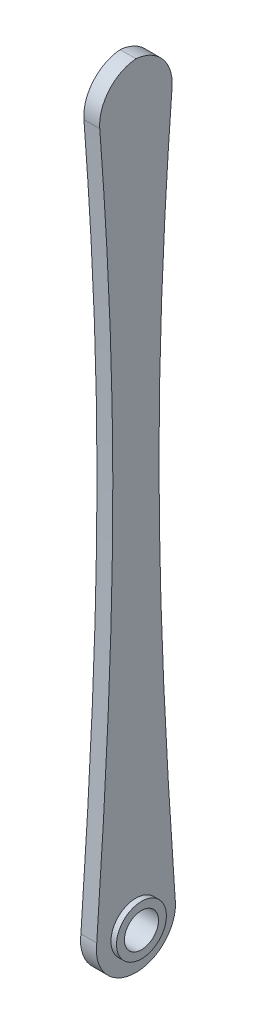
ISO-10303-21;
HEADER;
FILE_DESCRIPTION(('STEP AP214'),'2;1');
FILE_NAME('part.step','',(''),(''),'','','');
FILE_SCHEMA(('AUTOMOTIVE_DESIGN { 1 0 10303 214 1 1 1 1 }'));
ENDSEC;
DATA;
#1=APPLICATION_CONTEXT('core data for automotive mechanical design processes');
#2=APPLICATION_PROTOCOL_DEFINITION('international standard','automotive_design',2000,#1);
#3=PRODUCT_CONTEXT('',#1,'mechanical');
#4=PRODUCT('Part','Part','',(#3));
#5=PRODUCT_RELATED_PRODUCT_CATEGORY('part','',(#4));
#6=PRODUCT_DEFINITION_FORMATION('','',#4);
#7=PRODUCT_DEFINITION_CONTEXT('part definition',#1,'design');
#8=PRODUCT_DEFINITION('design','',#6,#7);
#9=PRODUCT_DEFINITION_SHAPE('','',#8);
#10=(LENGTH_UNIT() NAMED_UNIT(*) SI_UNIT(.MILLI.,.METRE.));
#11=(NAMED_UNIT(*) PLANE_ANGLE_UNIT() SI_UNIT($,.RADIAN.));
#12=(NAMED_UNIT(*) SI_UNIT($,.STERADIAN.) SOLID_ANGLE_UNIT());
#13=UNCERTAINTY_MEASURE_WITH_UNIT(LENGTH_MEASURE(1.E-05),#10,'distance_accuracy_value','');
#14=(GEOMETRIC_REPRESENTATION_CONTEXT(3) GLOBAL_UNCERTAINTY_ASSIGNED_CONTEXT((#13)) GLOBAL_UNIT_ASSIGNED_CONTEXT((#10,
#11,#12)) REPRESENTATION_CONTEXT('',''));
#15=CARTESIAN_POINT('',(0.,0.,0.));
#16=DIRECTION('',(0.,0.,1.));
#17=DIRECTION('',(1.,0.,0.));
#18=AXIS2_PLACEMENT_3D('',#15,#16,#17);
#19=CARTESIAN_POINT('',(2.,100.,0.));
#20=DIRECTION('',(-1.,0.,0.));
#21=DIRECTION('',(0.,0.,1.));
#22=AXIS2_PLACEMENT_3D('',#19,#20,#21);
#23=PLANE('',#22);
#24=CARTESIAN_POINT('',(2.00000000000003,5.,-10.));
#25=CARTESIAN_POINT('',(2.00000000000003,42.4076656753099,-7.33661914245611));
#26=CARTESIAN_POINT('',(2.00000000000003,65.4643007817263,-7.11394721951599));
#27=CARTESIAN_POINT('',(2.00000000000003,100.,-10.));
#28=B_SPLINE_CURVE_WITH_KNOTS('',3,(#24,#25,#26,#27),.UNSPECIFIED.,.F.,.F.,(4,4),(0.,1.),.UNSPECIFIED.);
#29=CARTESIAN_POINT('',(2.00000000000006,5.70602627107516,-9.94990170655456));
#30=VERTEX_POINT('',#29);
#31=CARTESIAN_POINT('',(2.00000000000003,94.6179167102391,-9.56845710973133));
#32=VERTEX_POINT('',#31);
#33=EDGE_CURVE('E121',#30,#32,#28,.T.);
#34=ORIENTED_EDGE('',*,*,#33,.T.);
#35=CARTESIAN_POINT('',(2.,95.,-4.58307724860886));
#36=DIRECTION('',(-1.,0.,0.));
#37=DIRECTION('',(0.,0.,1.));
#38=AXIS2_PLACEMENT_3D('',#35,#36,#37);
#39=CIRCLE('',#38,5.);
#40=CARTESIAN_POINT('',(2.,99.9825872214515,-5.));
#41=VERTEX_POINT('',#40);
#42=EDGE_CURVE('E63',#32,#41,#39,.F.);
#43=ORIENTED_EDGE('',*,*,#42,.T.);
#44=CARTESIAN_POINT('',(2.,95.,-5.41692275139114));
#45=DIRECTION('',(-1.,0.,0.));
#46=DIRECTION('',(0.,0.,1.));
#47=AXIS2_PLACEMENT_3D('',#44,#45,#46);
#48=CIRCLE('',#47,5.);
#49=CARTESIAN_POINT('',(2.00000000000003,94.6179167102391,-0.431542890268665));
#50=VERTEX_POINT('',#49);
#51=EDGE_CURVE('E67',#41,#50,#48,.F.);
#52=ORIENTED_EDGE('',*,*,#51,.T.);
#53=CARTESIAN_POINT('',(2.00000000000003,5.,0.));
#54=CARTESIAN_POINT('',(2.00000000000003,42.4076656753099,-2.6633808575439));
#55=CARTESIAN_POINT('',(2.00000000000003,65.4643007817263,-2.886052780484));
#56=CARTESIAN_POINT('',(2.00000000000003,100.,0.));
#57=B_SPLINE_CURVE_WITH_KNOTS('',3,(#53,#54,#55,#56),.UNSPECIFIED.,.F.,.F.,(4,4),(0.,1.),.UNSPECIFIED.);
#58=CARTESIAN_POINT('',(2.00000000000003,5.70602627107514,-0.0500982934454421));
#59=VERTEX_POINT('',#58);
#60=EDGE_CURVE('E123',#59,#50,#57,.T.);
#61=ORIENTED_EDGE('',*,*,#60,.F.);
#62=CARTESIAN_POINT('',(2.,5.,-5.));
#63=DIRECTION('',(-1.,0.,0.));
#64=DIRECTION('',(0.,0.,1.));
#65=AXIS2_PLACEMENT_3D('',#62,#63,#64);
#66=CIRCLE('',#65,5.);
#67=CARTESIAN_POINT('',(2.,0.,-5.));
#68=VERTEX_POINT('',#67);
#69=EDGE_CURVE('E111',#59,#68,#66,.F.);
#70=ORIENTED_EDGE('',*,*,#69,.T.);
#71=CARTESIAN_POINT('',(2.,5.,-5.));
#72=DIRECTION('',(-1.,0.,0.));
#73=DIRECTION('',(0.,0.,1.));
#74=AXIS2_PLACEMENT_3D('',#71,#72,#73);
#75=CIRCLE('',#74,5.);
#76=EDGE_CURVE('E197',#68,#30,#75,.F.);
#77=ORIENTED_EDGE('',*,*,#76,.T.);
#78=EDGE_LOOP('',(#34,#43,#52,#61,#70,#77));
#79=FACE_BOUND('',#78,.T.);
#80=CARTESIAN_POINT('',(2.,5.,-5.));
#81=DIRECTION('',(-1.,0.,0.));
#82=DIRECTION('',(0.,0.,1.));
#83=AXIS2_PLACEMENT_3D('',#80,#81,#82);
#84=CIRCLE('',#83,3.15);
#85=CARTESIAN_POINT('',(2.,5.,-1.85));
#86=VERTEX_POINT('',#85);
#87=EDGE_CURVE('E11',#86,#86,#84,.F.);
#88=ORIENTED_EDGE('',*,*,#87,.F.);
#89=EDGE_LOOP('',(#88));
#90=FACE_BOUND('',#89,.T.);
#91=ADVANCED_FACE('F47',(#79,#90),#23,.F.);
#92=CARTESIAN_POINT('',(0.,100.,0.));
#93=DIRECTION('',(1.,0.,0.));
#94=DIRECTION('',(0.,0.,-1.));
#95=AXIS2_PLACEMENT_3D('',#92,#93,#94);
#96=PLANE('',#95);
#97=CARTESIAN_POINT('',(0.,5.,-5.));
#98=DIRECTION('',(1.,0.,0.));
#99=DIRECTION('',(0.,0.,-1.));
#100=AXIS2_PLACEMENT_3D('',#97,#98,#99);
#101=CIRCLE('',#100,3.15);
#102=CARTESIAN_POINT('',(0.,5.,-8.15));
#103=VERTEX_POINT('',#102);
#104=EDGE_CURVE('E243',#103,#103,#101,.T.);
#105=ORIENTED_EDGE('',*,*,#104,.T.);
#106=EDGE_LOOP('',(#105));
#107=FACE_BOUND('',#106,.T.);
#108=CARTESIAN_POINT('',(0.,95.,-5.41692275139114));
#109=DIRECTION('',(1.,0.,0.));
#110=DIRECTION('',(0.,0.,-1.));
#111=AXIS2_PLACEMENT_3D('',#108,#109,#110);
#112=CIRCLE('',#111,5.);
#113=CARTESIAN_POINT('',(0.,94.6179167102391,-0.431542890268664));
#114=VERTEX_POINT('',#113);
#115=CARTESIAN_POINT('',(0.,99.9825872214515,-5.));
#116=VERTEX_POINT('',#115);
#117=EDGE_CURVE('E221',#114,#116,#112,.F.);
#118=ORIENTED_EDGE('',*,*,#117,.T.);
#119=CARTESIAN_POINT('',(0.,95.,-4.58307724860886));
#120=DIRECTION('',(1.,0.,0.));
#121=DIRECTION('',(0.,0.,-1.));
#122=AXIS2_PLACEMENT_3D('',#119,#120,#121);
#123=CIRCLE('',#122,5.);
#124=CARTESIAN_POINT('',(0.,94.6179167102391,-9.56845710973133));
#125=VERTEX_POINT('',#124);
#126=EDGE_CURVE('E127',#116,#125,#123,.F.);
#127=ORIENTED_EDGE('',*,*,#126,.T.);
#128=CARTESIAN_POINT('',(0.,5.,-10.));
#129=CARTESIAN_POINT('',(0.,42.4076656753099,-7.33661914245611));
#130=CARTESIAN_POINT('',(0.,65.4643007817263,-7.11394721951599));
#131=CARTESIAN_POINT('',(0.,100.,-10.));
#132=B_SPLINE_CURVE_WITH_KNOTS('',3,(#128,#129,#130,#131),.UNSPECIFIED.,.F.,.F.,(4,4),(0.,1.),.UNSPECIFIED.);
#133=CARTESIAN_POINT('',(0.,5.70602627107516,-9.94990170655456));
#134=VERTEX_POINT('',#133);
#135=EDGE_CURVE('E119',#134,#125,#132,.T.);
#136=ORIENTED_EDGE('',*,*,#135,.F.);
#137=CARTESIAN_POINT('',(0.,5.,-5.));
#138=DIRECTION('',(1.,0.,0.));
#139=DIRECTION('',(0.,0.,-1.));
#140=AXIS2_PLACEMENT_3D('',#137,#138,#139);
#141=CIRCLE('',#140,5.);
#142=CARTESIAN_POINT('',(0.,0.,-5.));
#143=VERTEX_POINT('',#142);
#144=EDGE_CURVE('E100',#134,#143,#141,.F.);
#145=ORIENTED_EDGE('',*,*,#144,.T.);
#146=CARTESIAN_POINT('',(0.,5.,-5.));
#147=DIRECTION('',(1.,0.,0.));
#148=DIRECTION('',(0.,0.,-1.));
#149=AXIS2_PLACEMENT_3D('',#146,#147,#148);
#150=CIRCLE('',#149,5.);
#151=CARTESIAN_POINT('',(0.,5.70602627107514,-0.0500982934454417));
#152=VERTEX_POINT('',#151);
#153=EDGE_CURVE('E112',#143,#152,#150,.F.);
#154=ORIENTED_EDGE('',*,*,#153,.T.);
#155=CARTESIAN_POINT('',(0.,5.,0.));
#156=CARTESIAN_POINT('',(0.,42.4076656753099,-2.6633808575439));
#157=CARTESIAN_POINT('',(0.,65.4643007817263,-2.886052780484));
#158=CARTESIAN_POINT('',(0.,100.,0.));
#159=B_SPLINE_CURVE_WITH_KNOTS('',3,(#155,#156,#157,#158),.UNSPECIFIED.,.F.,.F.,(4,4),(0.,1.),.UNSPECIFIED.);
#160=EDGE_CURVE('E133',#152,#114,#159,.T.);
#161=ORIENTED_EDGE('',*,*,#160,.T.);
#162=EDGE_LOOP('',(#118,#127,#136,#145,#154,#161));
#163=FACE_BOUND('',#162,.T.);
#164=ADVANCED_FACE('F125',(#107,#163),#96,.F.);
#165=CARTESIAN_POINT('',(-88.,5.,-4.99999999999998));
#166=DIRECTION('',(1.,0.,0.));
#167=DIRECTION('',(0.,0.,-1.));
#168=AXIS2_PLACEMENT_3D('',#165,#166,#167);
#169=CYLINDRICAL_SURFACE('',#168,2.15);
#170=CARTESIAN_POINT('',(2.7,5.,-5.));
#171=DIRECTION('',(1.,0.,0.));
#172=DIRECTION('',(0.,0.,-1.));
#173=AXIS2_PLACEMENT_3D('',#170,#171,#172);
#174=CIRCLE('',#173,2.15);
#175=CARTESIAN_POINT('',(2.69999999999999,5.,-7.15));
#176=VERTEX_POINT('',#175);
#177=EDGE_CURVE('E236',#176,#176,#174,.T.);
#178=CARTESIAN_POINT('',(-0.700000000000001,5.,-5.));
#179=DIRECTION('',(1.,0.,0.));
#180=DIRECTION('',(0.,0.,-1.));
#181=AXIS2_PLACEMENT_3D('',#178,#179,#180);
#182=CIRCLE('',#181,2.15);
#183=CARTESIAN_POINT('',(-0.699999999999992,5.,-7.15));
#184=VERTEX_POINT('',#183);
#185=EDGE_CURVE('E247',#184,#184,#182,.T.);
#186=CARTESIAN_POINT('',(2.69999999999999,5.,-7.15));
#187=CARTESIAN_POINT('',(2.66458333333333,5.,-7.15));
#188=CARTESIAN_POINT('',(2.62916666666666,5.,-7.15));
#189=CARTESIAN_POINT('',(2.55833333333332,5.,-7.15));
#190=CARTESIAN_POINT('',(2.52291666666666,5.,-7.15));
#191=CARTESIAN_POINT('',(2.45208333333333,5.,-7.15));
#192=CARTESIAN_POINT('',(2.41666666666666,5.,-7.15));
#193=CARTESIAN_POINT('',(2.34583333333333,5.,-7.15));
#194=CARTESIAN_POINT('',(2.31041666666667,5.,-7.15));
#195=CARTESIAN_POINT('',(2.23958333333333,5.,-7.15));
#196=CARTESIAN_POINT('',(2.20416666666666,5.,-7.15));
#197=CARTESIAN_POINT('',(2.13333333333333,5.,-7.15));
#198=CARTESIAN_POINT('',(2.09791666666666,5.,-7.15));
#199=CARTESIAN_POINT('',(2.02708333333333,5.,-7.15));
#200=CARTESIAN_POINT('',(1.99166666666666,5.,-7.15));
#201=CARTESIAN_POINT('',(1.92083333333333,5.,-7.15));
#202=CARTESIAN_POINT('',(1.88541666666667,5.,-7.15));
#203=CARTESIAN_POINT('',(1.81458333333334,5.,-7.15));
#204=CARTESIAN_POINT('',(1.77916666666667,5.,-7.15));
#205=CARTESIAN_POINT('',(1.70833333333333,5.,-7.15));
#206=CARTESIAN_POINT('',(1.67291666666667,5.,-7.15));
#207=CARTESIAN_POINT('',(1.60208333333333,5.,-7.15));
#208=CARTESIAN_POINT('',(1.56666666666667,5.,-7.15));
#209=CARTESIAN_POINT('',(1.49583333333333,5.,-7.15));
#210=CARTESIAN_POINT('',(1.46041666666666,5.,-7.15));
#211=CARTESIAN_POINT('',(1.38958333333333,5.,-7.15));
#212=CARTESIAN_POINT('',(1.35416666666666,5.,-7.15));
#213=CARTESIAN_POINT('',(1.28333333333333,5.,-7.15));
#214=CARTESIAN_POINT('',(1.24791666666667,5.,-7.15));
#215=CARTESIAN_POINT('',(1.17708333333334,5.,-7.15));
#216=CARTESIAN_POINT('',(1.14166666666667,5.,-7.15));
#217=CARTESIAN_POINT('',(1.07083333333334,5.,-7.15));
#218=CARTESIAN_POINT('',(1.03541666666667,5.,-7.15));
#219=CARTESIAN_POINT('',(0.964583333333333,5.,-7.15));
#220=CARTESIAN_POINT('',(0.929166666666666,5.,-7.15));
#221=CARTESIAN_POINT('',(0.858333333333331,5.,-7.15));
#222=CARTESIAN_POINT('',(0.822916666666664,5.,-7.15));
#223=CARTESIAN_POINT('',(0.752083333333334,5.,-7.15));
#224=CARTESIAN_POINT('',(0.716666666666671,5.,-7.15));
#225=CARTESIAN_POINT('',(0.645833333333341,5.,-7.15));
#226=CARTESIAN_POINT('',(0.610416666666673,5.,-7.15));
#227=CARTESIAN_POINT('',(0.539583333333339,5.,-7.15));
#228=CARTESIAN_POINT('',(0.504166666666671,5.,-7.15));
#229=CARTESIAN_POINT('',(0.433333333333336,5.,-7.15));
#230=CARTESIAN_POINT('',(0.397916666666669,5.,-7.15));
#231=CARTESIAN_POINT('',(0.327083333333334,5.,-7.15));
#232=CARTESIAN_POINT('',(0.291666666666667,5.,-7.15));
#233=CARTESIAN_POINT('',(0.220833333333332,5.,-7.15));
#234=CARTESIAN_POINT('',(0.185416666666665,5.,-7.15));
#235=CARTESIAN_POINT('',(0.114583333333335,5.,-7.15));
#236=CARTESIAN_POINT('',(0.0791666666666718,5.,-7.15));
#237=CARTESIAN_POINT('',(0.00833333333334167,5.,-7.15));
#238=CARTESIAN_POINT('',(-0.0270833333333257,5.,-7.15));
#239=CARTESIAN_POINT('',(-0.0979166666666605,5.,-7.15));
#240=CARTESIAN_POINT('',(-0.133333333333328,5.,-7.15));
#241=CARTESIAN_POINT('',(-0.204166666666663,5.,-7.15));
#242=CARTESIAN_POINT('',(-0.23958333333333,5.,-7.15));
#243=CARTESIAN_POINT('',(-0.310416666666665,5.,-7.15));
#244=CARTESIAN_POINT('',(-0.345833333333332,5.,-7.15));
#245=CARTESIAN_POINT('',(-0.416666666666662,5.,-7.15));
#246=CARTESIAN_POINT('',(-0.452083333333325,5.,-7.15));
#247=CARTESIAN_POINT('',(-0.522916666666655,5.,-7.15));
#248=CARTESIAN_POINT('',(-0.558333333333323,5.,-7.15));
#249=CARTESIAN_POINT('',(-0.629166666666657,5.,-7.15));
#250=CARTESIAN_POINT('',(-0.664583333333325,5.,-7.15));
#251=CARTESIAN_POINT('',(-0.699999999999992,5.,-7.15));
#252=B_SPLINE_CURVE_WITH_KNOTS('',3,(#186,#187,#188,#189,#190,#191,#192,#193,#194,#195,#196,
#197,#198,#199,#200,#201,#202,#203,#204,#205,#206,#207,#208,#209,#210,#211,#212,#213,#214,#215,
#216,#217,#218,#219,#220,#221,#222,#223,#224,#225,#226,#227,#228,#229,#230,#231,#232,#233,#234,
#235,#236,#237,#238,#239,#240,#241,#242,#243,#244,#245,#246,#247,#248,#249,#250,#251),
.UNSPECIFIED.,.F.,.F.,(4,2,2,2,2,2,2,2,2,2,2,2,2,2,2,2,2,2,2,2,2,2,2,2,2,2,2,2,2,2,2,2,4),(0.,
0.106250000000002,0.212500000000004,0.318749999999993,0.424999999999995,0.531249999999997,
0.637499999999999,0.743750000000001,0.84999999999999,0.956249999999992,1.06249999999999,1.16875,
1.275,1.38125,1.48749999999999,1.59374999999999,1.69999999999999,1.80625,1.9125,
2.01874999999999,2.12499999999999,2.23124999999999,2.33749999999999,2.44374999999999,2.55,
2.65624999999998,2.76249999999999,2.86874999999999,2.97499999999999,3.08124999999999,
3.18749999999998,3.29374999999998,3.39999999999999),.UNSPECIFIED.);
#253=EDGE_CURVE('BSEAM162',#176,#184,#252,.T.);
#254=ORIENTED_EDGE('',*,*,#177,.T.);
#255=ORIENTED_EDGE('',*,*,#185,.F.);
#256=ORIENTED_EDGE('',*,*,#253,.T.);
#257=ORIENTED_EDGE('',*,*,#253,.F.);
#258=EDGE_LOOP('',(#254,#256,#255,#257));
#259=FACE_BOUND('',#258,.T.);
#260=ADVANCED_FACE('F162',(#259),#169,.F.);
#261=CARTESIAN_POINT('',(0.,5.,-5.));
#262=DIRECTION('',(-1.,0.,0.));
#263=DIRECTION('',(0.,0.,1.));
#264=AXIS2_PLACEMENT_3D('',#261,#262,#263);
#265=CYLINDRICAL_SURFACE('',#264,5.);
#266=DIRECTION('',(1.,0.,0.));
#267=VECTOR('',#266,1.);
#268=CARTESIAN_POINT('',(0.,0.,-5.));
#269=LINE('',#268,#267);
#270=EDGE_CURVE('E106',#68,#143,#269,.F.);
#271=ORIENTED_EDGE('',*,*,#270,.F.);
#272=ORIENTED_EDGE('',*,*,#69,.F.);
#273=DIRECTION('',(-1.,0.,0.));
#274=VECTOR('',#273,1.);
#275=CARTESIAN_POINT('',(90.,5.70602627107514,-0.0500982934454573));
#276=LINE('',#275,#274);
#277=EDGE_CURVE('E129',#59,#152,#276,.T.);
#278=ORIENTED_EDGE('',*,*,#277,.T.);
#279=ORIENTED_EDGE('',*,*,#153,.F.);
#280=EDGE_LOOP('',(#271,#272,#278,#279));
#281=FACE_BOUND('',#280,.T.);
#282=ADVANCED_FACE('F165',(#281),#265,.T.);
#283=CARTESIAN_POINT('',(0.,5.,-5.));
#284=DIRECTION('',(1.,0.,0.));
#285=DIRECTION('',(0.,0.,-1.));
#286=AXIS2_PLACEMENT_3D('',#283,#284,#285);
#287=CYLINDRICAL_SURFACE('',#286,5.);
#288=ORIENTED_EDGE('',*,*,#76,.F.);
#289=ORIENTED_EDGE('',*,*,#270,.T.);
#290=ORIENTED_EDGE('',*,*,#144,.F.);
#291=DIRECTION('',(-1.,0.,0.));
#292=VECTOR('',#291,1.);
#293=CARTESIAN_POINT('',(90.,5.70602627107516,-9.94990170655457));
#294=LINE('',#293,#292);
#295=EDGE_CURVE('E104',#30,#134,#294,.T.);
#296=ORIENTED_EDGE('',*,*,#295,.F.);
#297=EDGE_LOOP('',(#288,#289,#290,#296));
#298=FACE_BOUND('',#297,.T.);
#299=ADVANCED_FACE('F103',(#298),#287,.T.);
#300=CARTESIAN_POINT('',(90.,5.,-10.));
#301=CARTESIAN_POINT('',(90.,42.4076656753099,-7.33661914245613));
#302=CARTESIAN_POINT('',(90.,65.4643007817263,-7.11394721951601));
#303=CARTESIAN_POINT('',(90.,100.,-10.));
#304=B_SPLINE_CURVE_WITH_KNOTS('',3,(#300,#301,#302,#303),.UNSPECIFIED.,.F.,.F.,(4,4),(0.,1.),.UNSPECIFIED.);
#305=DIRECTION('',(-1.,0.,0.));
#306=VECTOR('',#305,1.);
#307=SURFACE_OF_LINEAR_EXTRUSION('',#304,#306);
#308=ORIENTED_EDGE('',*,*,#135,.T.);
#309=DIRECTION('',(-1.,0.,0.));
#310=VECTOR('',#309,1.);
#311=CARTESIAN_POINT('',(0.,94.6179167102391,-9.56845710973133));
#312=LINE('',#311,#310);
#313=EDGE_CURVE('E189',#125,#32,#312,.F.);
#314=ORIENTED_EDGE('',*,*,#313,.T.);
#315=ORIENTED_EDGE('',*,*,#33,.F.);
#316=ORIENTED_EDGE('',*,*,#295,.T.);
#317=EDGE_LOOP('',(#308,#314,#315,#316));
#318=FACE_BOUND('',#317,.T.);
#319=ADVANCED_FACE('F117',(#318),#307,.F.);
#320=CARTESIAN_POINT('',(90.,5.,0.));
#321=CARTESIAN_POINT('',(90.,42.4076656753099,-2.66338085754391));
#322=CARTESIAN_POINT('',(90.,65.4643007817263,-2.88605278048401));
#323=CARTESIAN_POINT('',(90.,100.,0.));
#324=B_SPLINE_CURVE_WITH_KNOTS('',3,(#320,#321,#322,#323),.UNSPECIFIED.,.F.,.F.,(4,4),(0.,1.),.UNSPECIFIED.);
#325=DIRECTION('',(-1.,0.,0.));
#326=VECTOR('',#325,1.);
#327=SURFACE_OF_LINEAR_EXTRUSION('',#324,#326);
#328=ORIENTED_EDGE('',*,*,#60,.T.);
#329=DIRECTION('',(-1.,0.,0.));
#330=VECTOR('',#329,1.);
#331=CARTESIAN_POINT('',(2.00000000000003,94.6179167102391,-0.431542890268665));
#332=LINE('',#331,#330);
#333=EDGE_CURVE('E56',#50,#114,#332,.T.);
#334=ORIENTED_EDGE('',*,*,#333,.T.);
#335=ORIENTED_EDGE('',*,*,#160,.F.);
#336=ORIENTED_EDGE('',*,*,#277,.F.);
#337=EDGE_LOOP('',(#328,#334,#335,#336));
#338=FACE_BOUND('',#337,.T.);
#339=ADVANCED_FACE('F156',(#338),#327,.T.);
#340=CARTESIAN_POINT('',(1.00000000000003,95.,-5.41692275139114));
#341=DIRECTION('',(-1.,0.,0.));
#342=DIRECTION('',(0.,0.,1.));
#343=AXIS2_PLACEMENT_3D('',#340,#341,#342);
#344=CYLINDRICAL_SURFACE('',#343,5.);
#345=ORIENTED_EDGE('',*,*,#333,.F.);
#346=ORIENTED_EDGE('',*,*,#51,.F.);
#347=DIRECTION('',(-1.,0.,0.));
#348=VECTOR('',#347,1.);
#349=CARTESIAN_POINT('',(1.00000000000001,99.9825872214515,-5.));
#350=LINE('',#349,#348);
#351=EDGE_CURVE('E191',#116,#41,#350,.F.);
#352=ORIENTED_EDGE('',*,*,#351,.F.);
#353=ORIENTED_EDGE('',*,*,#117,.F.);
#354=EDGE_LOOP('',(#345,#346,#352,#353));
#355=FACE_BOUND('',#354,.T.);
#356=ADVANCED_FACE('F49',(#355),#344,.T.);
#357=CARTESIAN_POINT('',(1.00000000000003,95.,-4.58307724860886));
#358=DIRECTION('',(-1.,0.,0.));
#359=DIRECTION('',(0.,0.,1.));
#360=AXIS2_PLACEMENT_3D('',#357,#358,#359);
#361=CYLINDRICAL_SURFACE('',#360,5.);
#362=ORIENTED_EDGE('',*,*,#42,.F.);
#363=ORIENTED_EDGE('',*,*,#313,.F.);
#364=ORIENTED_EDGE('',*,*,#126,.F.);
#365=ORIENTED_EDGE('',*,*,#351,.T.);
#366=EDGE_LOOP('',(#362,#363,#364,#365));
#367=FACE_BOUND('',#366,.T.);
#368=ADVANCED_FACE('F176',(#367),#361,.T.);
#369=CARTESIAN_POINT('',(2.7,5.,-5.));
#370=DIRECTION('',(1.,0.,0.));
#371=DIRECTION('',(0.,0.,-1.));
#372=AXIS2_PLACEMENT_3D('',#369,#370,#371);
#373=PLANE('',#372);
#374=CARTESIAN_POINT('',(2.7,5.,-5.));
#375=DIRECTION('',(1.,0.,0.));
#376=DIRECTION('',(0.,0.,-1.));
#377=AXIS2_PLACEMENT_3D('',#374,#375,#376);
#378=CIRCLE('',#377,3.15);
#379=CARTESIAN_POINT('',(2.7,5.,-8.15));
#380=VERTEX_POINT('',#379);
#381=EDGE_CURVE('E231',#380,#380,#378,.T.);
#382=ORIENTED_EDGE('',*,*,#381,.T.);
#383=EDGE_LOOP('',(#382));
#384=FACE_BOUND('',#383,.T.);
#385=ORIENTED_EDGE('',*,*,#177,.F.);
#386=EDGE_LOOP('',(#385));
#387=FACE_BOUND('',#386,.T.);
#388=ADVANCED_FACE('F178',(#384,#387),#373,.T.);
#389=CARTESIAN_POINT('',(2.7,5.,-5.));
#390=DIRECTION('',(-1.,0.,0.));
#391=DIRECTION('',(0.,0.,1.));
#392=AXIS2_PLACEMENT_3D('',#389,#390,#391);
#393=CYLINDRICAL_SURFACE('',#392,3.15);
#394=ORIENTED_EDGE('',*,*,#381,.F.);
#395=EDGE_LOOP('',(#394));
#396=FACE_BOUND('',#395,.T.);
#397=ORIENTED_EDGE('',*,*,#87,.T.);
#398=EDGE_LOOP('',(#397));
#399=FACE_BOUND('',#398,.T.);
#400=ADVANCED_FACE('F184',(#396,#399),#393,.T.);
#401=CARTESIAN_POINT('',(-0.700000000000001,5.,-5.));
#402=DIRECTION('',(1.,0.,0.));
#403=DIRECTION('',(0.,0.,-1.));
#404=AXIS2_PLACEMENT_3D('',#401,#402,#403);
#405=CYLINDRICAL_SURFACE('',#404,3.15);
#406=CARTESIAN_POINT('',(-0.700000000000001,5.,-5.));
#407=DIRECTION('',(1.,0.,0.));
#408=DIRECTION('',(0.,0.,-1.));
#409=AXIS2_PLACEMENT_3D('',#406,#407,#408);
#410=CIRCLE('',#409,3.15);
#411=CARTESIAN_POINT('',(-0.700000000000001,5.,-8.15));
#412=VERTEX_POINT('',#411);
#413=EDGE_CURVE('E240',#412,#412,#410,.T.);
#414=ORIENTED_EDGE('',*,*,#413,.T.);
#415=EDGE_LOOP('',(#414));
#416=FACE_BOUND('',#415,.T.);
#417=ORIENTED_EDGE('',*,*,#104,.F.);
#418=EDGE_LOOP('',(#417));
#419=FACE_BOUND('',#418,.T.);
#420=ADVANCED_FACE('F259',(#416,#419),#405,.T.);
#421=CARTESIAN_POINT('',(-0.700000000000001,5.,-5.));
#422=DIRECTION('',(-1.,0.,0.));
#423=DIRECTION('',(0.,0.,-1.));
#424=AXIS2_PLACEMENT_3D('',#421,#422,#423);
#425=PLANE('',#424);
#426=ORIENTED_EDGE('',*,*,#185,.T.);
#427=EDGE_LOOP('',(#426));
#428=FACE_BOUND('',#427,.T.);
#429=ORIENTED_EDGE('',*,*,#413,.F.);
#430=EDGE_LOOP('',(#429));
#431=FACE_BOUND('',#430,.T.);
#432=ADVANCED_FACE('F255',(#428,#431),#425,.T.);
#433=CLOSED_SHELL('',(#91,#164,#260,#282,#299,#319,#339,#356,#368,#388,#400,#420,#432));
#434=MANIFOLD_SOLID_BREP('B2',#433);
#435=ADVANCED_BREP_SHAPE_REPRESENTATION('',(#18,#434),#14);
#436=SHAPE_DEFINITION_REPRESENTATION(#9,#435);
ENDSEC;
END-ISO-10303-21;
